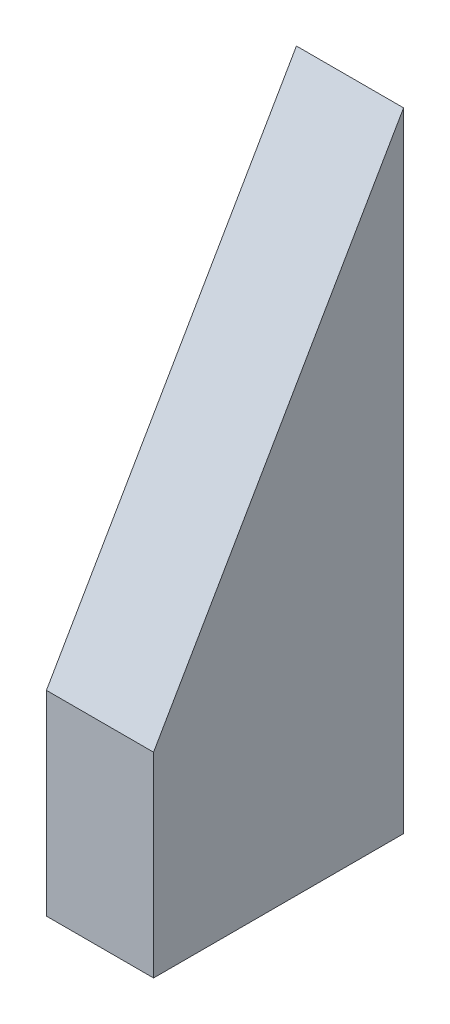
ISO-10303-21;
HEADER;
FILE_DESCRIPTION(('STEP AP214'),'2;1');
FILE_NAME('part.step','',(''),(''),'','','');
FILE_SCHEMA(('AUTOMOTIVE_DESIGN { 1 0 10303 214 1 1 1 1 }'));
ENDSEC;
DATA;
#1=APPLICATION_CONTEXT('core data for automotive mechanical design processes');
#2=APPLICATION_PROTOCOL_DEFINITION('international standard','automotive_design',2000,#1);
#3=PRODUCT_CONTEXT('',#1,'mechanical');
#4=PRODUCT('Part','Part','',(#3));
#5=PRODUCT_RELATED_PRODUCT_CATEGORY('part','',(#4));
#6=PRODUCT_DEFINITION_FORMATION('','',#4);
#7=PRODUCT_DEFINITION_CONTEXT('part definition',#1,'design');
#8=PRODUCT_DEFINITION('design','',#6,#7);
#9=PRODUCT_DEFINITION_SHAPE('','',#8);
#10=(LENGTH_UNIT() NAMED_UNIT(*) SI_UNIT(.MILLI.,.METRE.));
#11=(NAMED_UNIT(*) PLANE_ANGLE_UNIT() SI_UNIT($,.RADIAN.));
#12=(NAMED_UNIT(*) SI_UNIT($,.STERADIAN.) SOLID_ANGLE_UNIT());
#13=UNCERTAINTY_MEASURE_WITH_UNIT(LENGTH_MEASURE(1.E-05),#10,'distance_accuracy_value','');
#14=(GEOMETRIC_REPRESENTATION_CONTEXT(3) GLOBAL_UNCERTAINTY_ASSIGNED_CONTEXT((#13)) GLOBAL_UNIT_ASSIGNED_CONTEXT((#10,
#11,#12)) REPRESENTATION_CONTEXT('',''));
#15=CARTESIAN_POINT('',(0.,0.,0.));
#16=DIRECTION('',(0.,0.,1.));
#17=DIRECTION('',(1.,0.,0.));
#18=AXIS2_PLACEMENT_3D('',#15,#16,#17);
#19=CARTESIAN_POINT('',(18.75,220.,43.75));
#20=DIRECTION('',(-1.,0.,0.));
#21=DIRECTION('',(0.,0.,1.));
#22=AXIS2_PLACEMENT_3D('',#19,#20,#21);
#23=PLANE('',#22);
#24=DIRECTION('',(0.,-1.,0.));
#25=VECTOR('',#24,1.);
#26=CARTESIAN_POINT('',(18.75,220.,-43.75));
#27=LINE('',#26,#25);
#28=CARTESIAN_POINT('',(18.75,220.,-43.75));
#29=VERTEX_POINT('',#28);
#30=CARTESIAN_POINT('',(18.75,0.,-43.75));
#31=VERTEX_POINT('',#30);
#32=EDGE_CURVE('E11',#29,#31,#27,.T.);
#33=ORIENTED_EDGE('',*,*,#32,.F.);
#34=DIRECTION('',(0.,0.866025403784442,-0.499999999999995));
#35=VECTOR('',#34,1.);
#36=CARTESIAN_POINT('',(18.75,220.,-43.75));
#37=LINE('',#36,#35);
#38=CARTESIAN_POINT('',(18.75,68.4455543377211,43.75));
#39=VERTEX_POINT('',#38);
#40=EDGE_CURVE('E61',#39,#29,#37,.T.);
#41=ORIENTED_EDGE('',*,*,#40,.F.);
#42=DIRECTION('',(0.,-1.,0.));
#43=VECTOR('',#42,1.);
#44=CARTESIAN_POINT('',(18.75,220.,43.75));
#45=LINE('',#44,#43);
#46=CARTESIAN_POINT('',(18.75,0.,43.75));
#47=VERTEX_POINT('',#46);
#48=EDGE_CURVE('E91',#39,#47,#45,.T.);
#49=ORIENTED_EDGE('',*,*,#48,.T.);
#50=DIRECTION('',(0.,0.,-1.));
#51=VECTOR('',#50,1.);
#52=CARTESIAN_POINT('',(18.75,0.,43.75));
#53=LINE('',#52,#51);
#54=EDGE_CURVE('E104',#47,#31,#53,.T.);
#55=ORIENTED_EDGE('',*,*,#54,.T.);
#56=EDGE_LOOP('',(#33,#41,#49,#55));
#57=FACE_BOUND('',#56,.T.);
#58=ADVANCED_FACE('F45',(#57),#23,.F.);
#59=CARTESIAN_POINT('',(-18.75,220.,-43.75));
#60=DIRECTION('',(0.,0.,1.));
#61=DIRECTION('',(1.,0.,0.));
#62=AXIS2_PLACEMENT_3D('',#59,#60,#61);
#63=PLANE('',#62);
#64=DIRECTION('',(-1.,0.,0.));
#65=VECTOR('',#64,1.);
#66=CARTESIAN_POINT('',(-18.75,0.,-43.75));
#67=LINE('',#66,#65);
#68=CARTESIAN_POINT('',(-18.75,0.,-43.75));
#69=VERTEX_POINT('',#68);
#70=EDGE_CURVE('E100',#31,#69,#67,.T.);
#71=ORIENTED_EDGE('',*,*,#70,.T.);
#72=DIRECTION('',(0.,-1.,0.));
#73=VECTOR('',#72,1.);
#74=CARTESIAN_POINT('',(-18.75,220.,-43.75));
#75=LINE('',#74,#73);
#76=CARTESIAN_POINT('',(-18.75,220.,-43.75));
#77=VERTEX_POINT('',#76);
#78=EDGE_CURVE('E54',#77,#69,#75,.T.);
#79=ORIENTED_EDGE('',*,*,#78,.F.);
#80=DIRECTION('',(-1.,0.,0.));
#81=VECTOR('',#80,1.);
#82=CARTESIAN_POINT('',(-18.75,220.,-43.75));
#83=LINE('',#82,#81);
#84=EDGE_CURVE('E106',#29,#77,#83,.T.);
#85=ORIENTED_EDGE('',*,*,#84,.F.);
#86=ORIENTED_EDGE('',*,*,#32,.T.);
#87=EDGE_LOOP('',(#71,#79,#85,#86));
#88=FACE_BOUND('',#87,.T.);
#89=ADVANCED_FACE('F124',(#88),#63,.F.);
#90=CARTESIAN_POINT('',(-18.75,220.,43.75));
#91=DIRECTION('',(1.,0.,0.));
#92=DIRECTION('',(0.,0.,-1.));
#93=AXIS2_PLACEMENT_3D('',#90,#91,#92);
#94=PLANE('',#93);
#95=DIRECTION('',(0.,-1.,0.));
#96=VECTOR('',#95,1.);
#97=CARTESIAN_POINT('',(-18.75,220.,43.75));
#98=LINE('',#97,#96);
#99=CARTESIAN_POINT('',(-18.75,68.4455543377211,43.75));
#100=VERTEX_POINT('',#99);
#101=CARTESIAN_POINT('',(-18.75,0.,43.75));
#102=VERTEX_POINT('',#101);
#103=EDGE_CURVE('E79',#100,#102,#98,.T.);
#104=ORIENTED_EDGE('',*,*,#103,.F.);
#105=DIRECTION('',(0.,0.866025403784442,-0.499999999999995));
#106=VECTOR('',#105,1.);
#107=CARTESIAN_POINT('',(-18.75,220.,-43.75));
#108=LINE('',#107,#106);
#109=EDGE_CURVE('E119',#100,#77,#108,.T.);
#110=ORIENTED_EDGE('',*,*,#109,.T.);
#111=ORIENTED_EDGE('',*,*,#78,.T.);
#112=DIRECTION('',(0.,0.,1.));
#113=VECTOR('',#112,1.);
#114=CARTESIAN_POINT('',(-18.75,0.,43.75));
#115=LINE('',#114,#113);
#116=EDGE_CURVE('E95',#69,#102,#115,.T.);
#117=ORIENTED_EDGE('',*,*,#116,.T.);
#118=EDGE_LOOP('',(#104,#110,#111,#117));
#119=FACE_BOUND('',#118,.T.);
#120=ADVANCED_FACE('F96',(#119),#94,.F.);
#121=CARTESIAN_POINT('',(-18.75,220.,43.75));
#122=DIRECTION('',(0.,0.,-1.));
#123=DIRECTION('',(-1.,0.,0.));
#124=AXIS2_PLACEMENT_3D('',#121,#122,#123);
#125=PLANE('',#124);
#126=ORIENTED_EDGE('',*,*,#48,.F.);
#127=DIRECTION('',(1.,0.,0.));
#128=VECTOR('',#127,1.);
#129=CARTESIAN_POINT('',(-18.75,68.4455543377211,43.75));
#130=LINE('',#129,#128);
#131=EDGE_CURVE('E87',#100,#39,#130,.T.);
#132=ORIENTED_EDGE('',*,*,#131,.F.);
#133=ORIENTED_EDGE('',*,*,#103,.T.);
#134=DIRECTION('',(1.,0.,0.));
#135=VECTOR('',#134,1.);
#136=CARTESIAN_POINT('',(-18.75,0.,43.75));
#137=LINE('',#136,#135);
#138=EDGE_CURVE('E84',#102,#47,#137,.T.);
#139=ORIENTED_EDGE('',*,*,#138,.T.);
#140=EDGE_LOOP('',(#126,#132,#133,#139));
#141=FACE_BOUND('',#140,.T.);
#142=ADVANCED_FACE('F82',(#141),#125,.F.);
#143=CARTESIAN_POINT('',(0.,0.,0.));
#144=DIRECTION('',(0.,-1.,0.));
#145=DIRECTION('',(0.,0.,-1.));
#146=AXIS2_PLACEMENT_3D('',#143,#144,#145);
#147=PLANE('',#146);
#148=ORIENTED_EDGE('',*,*,#54,.F.);
#149=ORIENTED_EDGE('',*,*,#138,.F.);
#150=ORIENTED_EDGE('',*,*,#116,.F.);
#151=ORIENTED_EDGE('',*,*,#70,.F.);
#152=EDGE_LOOP('',(#148,#149,#150,#151));
#153=FACE_BOUND('',#152,.T.);
#154=ADVANCED_FACE('F102',(#153),#147,.T.);
#155=CARTESIAN_POINT('',(-18.75,220.,-43.75));
#156=DIRECTION('',(0.,-0.499999999999995,-0.866025403784442));
#157=DIRECTION('',(0.,0.866025403784442,-0.499999999999995));
#158=AXIS2_PLACEMENT_3D('',#155,#156,#157);
#159=PLANE('',#158);
#160=ORIENTED_EDGE('',*,*,#84,.T.);
#161=ORIENTED_EDGE('',*,*,#109,.F.);
#162=ORIENTED_EDGE('',*,*,#131,.T.);
#163=ORIENTED_EDGE('',*,*,#40,.T.);
#164=EDGE_LOOP('',(#160,#161,#162,#163));
#165=FACE_BOUND('',#164,.T.);
#166=ADVANCED_FACE('F120',(#165),#159,.F.);
#167=CLOSED_SHELL('',(#58,#89,#120,#142,#154,#166));
#168=MANIFOLD_SOLID_BREP('B2',#167);
#169=ADVANCED_BREP_SHAPE_REPRESENTATION('',(#18,#168),#14);
#170=SHAPE_DEFINITION_REPRESENTATION(#9,#169);
ENDSEC;
END-ISO-10303-21;
